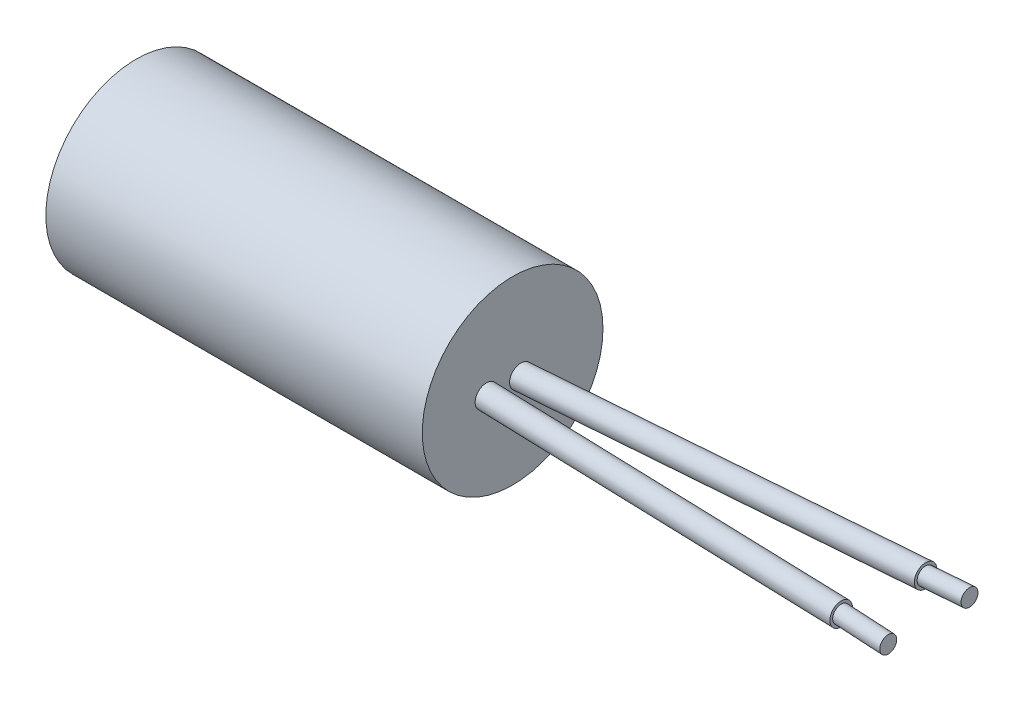
ISO-10303-21;
HEADER;
FILE_DESCRIPTION(('STEP AP214'),'2;1');
FILE_NAME('part.step','',(''),(''),'','','');
FILE_SCHEMA(('AUTOMOTIVE_DESIGN { 1 0 10303 214 1 1 1 1 }'));
ENDSEC;
DATA;
#1=APPLICATION_CONTEXT('core data for automotive mechanical design processes');
#2=APPLICATION_PROTOCOL_DEFINITION('international standard','automotive_design',2000,#1);
#3=PRODUCT_CONTEXT('',#1,'mechanical');
#4=PRODUCT('Part','Part','',(#3));
#5=PRODUCT_RELATED_PRODUCT_CATEGORY('part','',(#4));
#6=PRODUCT_DEFINITION_FORMATION('','',#4);
#7=PRODUCT_DEFINITION_CONTEXT('part definition',#1,'design');
#8=PRODUCT_DEFINITION('design','',#6,#7);
#9=PRODUCT_DEFINITION_SHAPE('','',#8);
#10=(LENGTH_UNIT() NAMED_UNIT(*) SI_UNIT(.MILLI.,.METRE.));
#11=(NAMED_UNIT(*) PLANE_ANGLE_UNIT() SI_UNIT($,.RADIAN.));
#12=(NAMED_UNIT(*) SI_UNIT($,.STERADIAN.) SOLID_ANGLE_UNIT());
#13=UNCERTAINTY_MEASURE_WITH_UNIT(LENGTH_MEASURE(1.E-05),#10,'distance_accuracy_value','');
#14=(GEOMETRIC_REPRESENTATION_CONTEXT(3) GLOBAL_UNCERTAINTY_ASSIGNED_CONTEXT((#13)) GLOBAL_UNIT_ASSIGNED_CONTEXT((#10,
#11,#12)) REPRESENTATION_CONTEXT('',''));
#15=CARTESIAN_POINT('',(0.,0.,0.));
#16=DIRECTION('',(0.,0.,1.));
#17=DIRECTION('',(1.,0.,0.));
#18=AXIS2_PLACEMENT_3D('',#15,#16,#17);
#19=CARTESIAN_POINT('',(20.,0.,0.));
#20=DIRECTION('',(-1.,0.,0.));
#21=DIRECTION('',(0.,0.,1.));
#22=AXIS2_PLACEMENT_3D('',#19,#20,#21);
#23=CYLINDRICAL_SURFACE('',#22,4.8);
#24=CARTESIAN_POINT('',(20.,0.,0.));
#25=DIRECTION('',(1.,0.,0.));
#26=DIRECTION('',(0.,0.,-1.));
#27=AXIS2_PLACEMENT_3D('',#24,#25,#26);
#28=CIRCLE('',#27,4.8);
#29=CARTESIAN_POINT('',(20.,0.,-4.8));
#30=VERTEX_POINT('',#29);
#31=EDGE_CURVE('E66',#30,#30,#28,.T.);
#32=ORIENTED_EDGE('',*,*,#31,.F.);
#33=EDGE_LOOP('',(#32));
#34=FACE_BOUND('',#33,.T.);
#35=CARTESIAN_POINT('',(0.,0.,0.));
#36=DIRECTION('',(1.,0.,0.));
#37=DIRECTION('',(0.,0.,-1.));
#38=AXIS2_PLACEMENT_3D('',#35,#36,#37);
#39=CIRCLE('',#38,4.8);
#40=CARTESIAN_POINT('',(0.,0.,-4.8));
#41=VERTEX_POINT('',#40);
#42=EDGE_CURVE('E60',#41,#41,#39,.T.);
#43=ORIENTED_EDGE('',*,*,#42,.T.);
#44=EDGE_LOOP('',(#43));
#45=FACE_BOUND('',#44,.T.);
#46=ADVANCED_FACE('F33',(#34,#45),#23,.T.);
#47=CARTESIAN_POINT('',(20.,0.,0.));
#48=DIRECTION('',(1.,0.,0.));
#49=DIRECTION('',(0.,0.,-1.));
#50=AXIS2_PLACEMENT_3D('',#47,#48,#49);
#51=PLANE('',#50);
#52=CARTESIAN_POINT('',(20.,0.,1.39254345856469));
#53=DIRECTION('',(1.,0.,0.));
#54=DIRECTION('',(0.,0.,-1.));
#55=AXIS2_PLACEMENT_3D('',#52,#53,#54);
#56=CIRCLE('',#55,0.6);
#57=CARTESIAN_POINT('',(20.,0.,0.792543458564689));
#58=VERTEX_POINT('',#57);
#59=EDGE_CURVE('E73',#58,#58,#56,.T.);
#60=ORIENTED_EDGE('',*,*,#59,.F.);
#61=EDGE_LOOP('',(#60));
#62=FACE_BOUND('',#61,.T.);
#63=CARTESIAN_POINT('',(20.,0.,-0.437533255997647));
#64=DIRECTION('',(1.,0.,0.));
#65=DIRECTION('',(0.,0.,-1.));
#66=AXIS2_PLACEMENT_3D('',#63,#64,#65);
#67=CIRCLE('',#66,0.6);
#68=CARTESIAN_POINT('',(20.,0.,-1.03753325599765));
#69=VERTEX_POINT('',#68);
#70=EDGE_CURVE('E69',#69,#69,#67,.T.);
#71=ORIENTED_EDGE('',*,*,#70,.F.);
#72=EDGE_LOOP('',(#71));
#73=FACE_BOUND('',#72,.T.);
#74=ORIENTED_EDGE('',*,*,#31,.T.);
#75=EDGE_LOOP('',(#74));
#76=FACE_BOUND('',#75,.T.);
#77=ADVANCED_FACE('F94',(#62,#73,#76),#51,.T.);
#78=CARTESIAN_POINT('',(0.,0.,0.));
#79=DIRECTION('',(1.,0.,0.));
#80=DIRECTION('',(0.,0.,-1.));
#81=AXIS2_PLACEMENT_3D('',#78,#79,#80);
#82=PLANE('',#81);
#83=ORIENTED_EDGE('',*,*,#42,.F.);
#84=EDGE_LOOP('',(#83));
#85=FACE_BOUND('',#84,.T.);
#86=ADVANCED_FACE('F85',(#85),#82,.F.);
#87=CARTESIAN_POINT('',(39.9388740322488,0.,-2.00000000000003));
#88=DIRECTION('',(1.,0.,0.));
#89=DIRECTION('',(0.,0.,-1.));
#90=AXIS2_PLACEMENT_3D('',#87,#88,#89);
#91=PLANE('',#90);
#92=CARTESIAN_POINT('',(39.9388740322488,0.,-2.00000000000003));
#93=DIRECTION('',(1.,0.,0.));
#94=DIRECTION('',(0.,0.,-1.));
#95=AXIS2_PLACEMENT_3D('',#92,#93,#94);
#96=CIRCLE('',#95,0.45);
#97=CARTESIAN_POINT('',(39.9388740322488,0.,-2.45000000000003));
#98=VERTEX_POINT('',#97);
#99=EDGE_CURVE('E45',#98,#98,#96,.T.);
#100=ORIENTED_EDGE('',*,*,#99,.F.);
#101=EDGE_LOOP('',(#100));
#102=FACE_BOUND('',#101,.T.);
#103=CARTESIAN_POINT('',(39.9388740322488,0.,-2.00000000000003));
#104=DIRECTION('',(1.,0.,0.));
#105=DIRECTION('',(0.,0.,-1.));
#106=AXIS2_PLACEMENT_3D('',#103,#104,#105);
#107=CIRCLE('',#106,0.6);
#108=CARTESIAN_POINT('',(39.9388740322488,0.,-2.60000000000003));
#109=VERTEX_POINT('',#108);
#110=EDGE_CURVE('E51',#109,#109,#107,.T.);
#111=ORIENTED_EDGE('',*,*,#110,.T.);
#112=EDGE_LOOP('',(#111));
#113=FACE_BOUND('',#112,.T.);
#114=ADVANCED_FACE('F82',(#102,#113),#91,.T.);
#115=CARTESIAN_POINT('',(20.,0.,-1.03753325599765));
#116=CARTESIAN_POINT('',(39.9388740322488,0.,-2.60000000000003));
#117=CARTESIAN_POINT('',(20.,1.2,-1.03753325599765));
#118=CARTESIAN_POINT('',(39.9388740322488,1.2,-2.60000000000003));
#119=CARTESIAN_POINT('',(20.,1.2,0.162466744002353));
#120=CARTESIAN_POINT('',(39.9388740322488,1.2,-1.40000000000003));
#121=CARTESIAN_POINT('',(20.,0.,0.162466744002353));
#122=CARTESIAN_POINT('',(39.9388740322488,0.,-1.40000000000003));
#123=CARTESIAN_POINT('',(20.,-1.2,0.162466744002353));
#124=CARTESIAN_POINT('',(39.9388740322488,-1.2,-1.40000000000003));
#125=CARTESIAN_POINT('',(20.,-1.2,-1.03753325599765));
#126=CARTESIAN_POINT('',(39.9388740322488,-1.2,-2.60000000000003));
#127=CARTESIAN_POINT('',(20.,0.,-1.03753325599765));
#128=CARTESIAN_POINT('',(39.9388740322488,0.,-2.60000000000003));
#129=(BOUNDED_SURFACE() B_SPLINE_SURFACE(3,1,((#115,#116),(#117,#118),(#119,#120),(#121,#122),
(#123,#124),(#125,#126),(#127,#128)),.UNSPECIFIED.,.T.,.F.,.F.) B_SPLINE_SURFACE_WITH_KNOTS((4,
3,4),(2,2),(0.,0.5,1.),(0.,1.),
.UNSPECIFIED.) GEOMETRIC_REPRESENTATION_ITEM() RATIONAL_B_SPLINE_SURFACE(((1.,1.),
(0.333333333333333,0.333333333333333),(0.333333333333333,0.333333333333333),(1.,1.),
(0.333333333333333,0.333333333333333),(0.333333333333333,0.333333333333333),(1.,1.))) REPRESENTATION_ITEM('') SURFACE());
#130=ORIENTED_EDGE('',*,*,#110,.F.);
#131=EDGE_LOOP('',(#130));
#132=FACE_BOUND('',#131,.T.);
#133=ORIENTED_EDGE('',*,*,#70,.T.);
#134=EDGE_LOOP('',(#133));
#135=FACE_BOUND('',#134,.T.);
#136=ADVANCED_FACE('F84',(#132,#135),#129,.T.);
#137=CARTESIAN_POINT('',(39.4528498119146,0.,2.));
#138=DIRECTION('',(1.,0.,0.));
#139=DIRECTION('',(0.,0.,-1.));
#140=AXIS2_PLACEMENT_3D('',#137,#138,#139);
#141=PLANE('',#140);
#142=CARTESIAN_POINT('',(39.4528498119146,0.,2.));
#143=DIRECTION('',(1.,0.,0.));
#144=DIRECTION('',(0.,0.,-1.));
#145=AXIS2_PLACEMENT_3D('',#142,#143,#144);
#146=CIRCLE('',#145,0.45);
#147=CARTESIAN_POINT('',(39.4528498119146,0.,1.55));
#148=VERTEX_POINT('',#147);
#149=EDGE_CURVE('E11',#148,#148,#146,.T.);
#150=ORIENTED_EDGE('',*,*,#149,.F.);
#151=EDGE_LOOP('',(#150));
#152=FACE_BOUND('',#151,.T.);
#153=CARTESIAN_POINT('',(39.4528498119146,0.,2.));
#154=DIRECTION('',(1.,0.,0.));
#155=DIRECTION('',(0.,0.,-1.));
#156=AXIS2_PLACEMENT_3D('',#153,#154,#155);
#157=CIRCLE('',#156,0.6);
#158=CARTESIAN_POINT('',(39.4528498119146,0.,1.4));
#159=VERTEX_POINT('',#158);
#160=EDGE_CURVE('E55',#159,#159,#157,.T.);
#161=ORIENTED_EDGE('',*,*,#160,.T.);
#162=EDGE_LOOP('',(#161));
#163=FACE_BOUND('',#162,.T.);
#164=ADVANCED_FACE('F56',(#152,#163),#141,.T.);
#165=CARTESIAN_POINT('',(20.,0.,0.792543458564689));
#166=CARTESIAN_POINT('',(39.4528498119146,0.,1.4));
#167=CARTESIAN_POINT('',(20.,1.2,0.792543458564689));
#168=CARTESIAN_POINT('',(39.4528498119146,1.2,1.4));
#169=CARTESIAN_POINT('',(20.,1.2,1.99254345856469));
#170=CARTESIAN_POINT('',(39.4528498119146,1.2,2.6));
#171=CARTESIAN_POINT('',(20.,0.,1.99254345856469));
#172=CARTESIAN_POINT('',(39.4528498119146,0.,2.6));
#173=CARTESIAN_POINT('',(20.,-1.2,1.99254345856469));
#174=CARTESIAN_POINT('',(39.4528498119146,-1.2,2.6));
#175=CARTESIAN_POINT('',(20.,-1.2,0.792543458564689));
#176=CARTESIAN_POINT('',(39.4528498119146,-1.2,1.4));
#177=CARTESIAN_POINT('',(20.,0.,0.792543458564689));
#178=CARTESIAN_POINT('',(39.4528498119146,0.,1.4));
#179=(BOUNDED_SURFACE() B_SPLINE_SURFACE(3,1,((#165,#166),(#167,#168),(#169,#170),(#171,#172),
(#173,#174),(#175,#176),(#177,#178)),.UNSPECIFIED.,.T.,.F.,.F.) B_SPLINE_SURFACE_WITH_KNOTS((4,
3,4),(2,2),(0.,0.5,1.),(0.,1.),
.UNSPECIFIED.) GEOMETRIC_REPRESENTATION_ITEM() RATIONAL_B_SPLINE_SURFACE(((1.,1.),
(0.333333333333333,0.333333333333333),(0.333333333333333,0.333333333333333),(1.,1.),
(0.333333333333333,0.333333333333333),(0.333333333333333,0.333333333333333),(1.,1.))) REPRESENTATION_ITEM('') SURFACE());
#180=ORIENTED_EDGE('',*,*,#160,.F.);
#181=EDGE_LOOP('',(#180));
#182=FACE_BOUND('',#181,.T.);
#183=ORIENTED_EDGE('',*,*,#59,.T.);
#184=EDGE_LOOP('',(#183));
#185=FACE_BOUND('',#184,.T.);
#186=ADVANCED_FACE('F87',(#182,#185),#179,.T.);
#187=CARTESIAN_POINT('',(39.9388740322488,0.,-2.45000000000003));
#188=CARTESIAN_POINT('',(52.6031303910479,0.,-3.44885690181726));
#189=CARTESIAN_POINT('',(39.9388740322488,0.899999999999999,-2.45000000000003));
#190=CARTESIAN_POINT('',(52.6031303910479,0.899999999999999,-3.44885690181726));
#191=CARTESIAN_POINT('',(39.9388740322488,0.9,-1.55000000000003));
#192=CARTESIAN_POINT('',(52.6031303910479,0.9,-2.54885690181726));
#193=CARTESIAN_POINT('',(39.9388740322488,0.,-1.55000000000003));
#194=CARTESIAN_POINT('',(52.6031303910479,0.,-2.54885690181726));
#195=CARTESIAN_POINT('',(39.9388740322488,-0.899999999999999,-1.55000000000003));
#196=CARTESIAN_POINT('',(52.6031303910479,-0.899999999999999,-2.54885690181726));
#197=CARTESIAN_POINT('',(39.9388740322488,-0.899999999999999,-2.45000000000003));
#198=CARTESIAN_POINT('',(52.6031303910479,-0.899999999999999,-3.44885690181726));
#199=CARTESIAN_POINT('',(39.9388740322488,0.,-2.45000000000003));
#200=CARTESIAN_POINT('',(52.6031303910479,0.,-3.44885690181726));
#201=(BOUNDED_SURFACE() B_SPLINE_SURFACE(3,1,((#187,#188),(#189,#190),(#191,#192),(#193,#194),
(#195,#196),(#197,#198),(#199,#200)),.UNSPECIFIED.,.T.,.F.,.F.) B_SPLINE_SURFACE_WITH_KNOTS((4,
3,4),(2,2),(0.,0.5,1.),(0.,1.),
.UNSPECIFIED.) GEOMETRIC_REPRESENTATION_ITEM() RATIONAL_B_SPLINE_SURFACE(((1.,1.),
(0.333333333333333,0.333333333333333),(0.333333333333333,0.333333333333333),(1.,1.),
(0.333333333333333,0.333333333333333),(0.333333333333333,0.333333333333333),(1.,1.))) REPRESENTATION_ITEM('') SURFACE());
#202=CARTESIAN_POINT('',(42.1027106585511,0.,-2.62066640846113));
#203=CARTESIAN_POINT('',(42.1027106585511,0.0249169708233576,-2.62066468284198));
#204=CARTESIAN_POINT('',(42.1027106585511,0.0498735638924442,-2.61858791322274));
#205=CARTESIAN_POINT('',(42.1027106585511,0.0994201301037329,-2.61027605702568));
#206=CARTESIAN_POINT('',(42.1027106585511,0.124000219793935,-2.60398370433206));
#207=CARTESIAN_POINT('',(42.1027106585511,0.171791638147212,-2.58735333393948));
#208=CARTESIAN_POINT('',(42.1027106585511,0.195001218587728,-2.57701027218953));
#209=CARTESIAN_POINT('',(42.1027106585511,0.239322182250796,-2.55258847955456));
#210=CARTESIAN_POINT('',(42.1027106585511,0.260436288226527,-2.53851468590238));
#211=CARTESIAN_POINT('',(42.1027106585511,0.300032074374395,-2.5070022088804));
#212=CARTESIAN_POINT('',(42.1027106585511,0.318510060414362,-2.48955888259262));
#213=CARTESIAN_POINT('',(42.1027106585511,0.352249191138487,-2.45184228675642));
#214=CARTESIAN_POINT('',(42.1027106585511,0.367514773498238,-2.43157298632042));
#215=CARTESIAN_POINT('',(42.1027106585511,0.39444792500363,-2.38873044271663));
#216=CARTESIAN_POINT('',(42.1027106585511,0.406110437057161,-2.36615401995835));
#217=CARTESIAN_POINT('',(42.1027106585511,0.425463238105003,-2.31939562393228));
#218=CARTESIAN_POINT('',(42.1027106585511,0.433159047641659,-2.29521593518316));
#219=CARTESIAN_POINT('',(42.1027106585511,0.444392839476786,-2.24587345011621));
#220=CARTESIAN_POINT('',(42.1027106585511,0.44792499547885,-2.22070932697466));
#221=CARTESIAN_POINT('',(42.1027106585511,0.450709561812633,-2.17018086717254));
#222=CARTESIAN_POINT('',(42.1027106585511,0.449967938357008,-2.14481685895979));
#223=CARTESIAN_POINT('',(42.1027106585511,0.444235829939363,-2.09453742119792));
#224=CARTESIAN_POINT('',(42.1027106585511,0.439239408370549,-2.06962266810674));
#225=CARTESIAN_POINT('',(42.1027106585511,0.425141800091125,-2.02102084379071));
#226=CARTESIAN_POINT('',(42.1027106585511,0.416046350234093,-1.99733210815797));
#227=CARTESIAN_POINT('',(42.1027106585511,0.393994589805185,-1.9517843441705));
#228=CARTESIAN_POINT('',(42.1027106585511,0.381032904079508,-1.92992791779314));
#229=CARTESIAN_POINT('',(42.1027106585511,0.351642568180791,-1.88873229266478));
#230=CARTESIAN_POINT('',(42.1027106585511,0.335218789415721,-1.86938961806514));
#231=CARTESIAN_POINT('',(42.1027106585511,0.299333566240612,-1.83370867367305));
#232=CARTESIAN_POINT('',(42.1027106585511,0.279867893291832,-1.81737465613546));
#233=CARTESIAN_POINT('',(42.1027106585511,0.238501030378269,-1.78823154007281));
#234=CARTESIAN_POINT('',(42.1027106585511,0.216603620810612,-1.77541707483586));
#235=CARTESIAN_POINT('',(42.1027106585511,0.170931229519899,-1.75362469725253));
#236=CARTESIAN_POINT('',(42.1027106585511,0.147153175751548,-1.74465322246248));
#237=CARTESIAN_POINT('',(42.1027106585511,0.0984276882864975,-1.73083316510967));
#238=CARTESIAN_POINT('',(42.1027106585511,0.0734802545897989,-1.72598458254691));
#239=CARTESIAN_POINT('',(42.1027106585511,0.0231675449583439,-1.72055261269379));
#240=CARTESIAN_POINT('',(42.1027106585511,-0.00219696567172409,-1.71996213358403));
#241=CARTESIAN_POINT('',(42.1027106585511,-0.0527046230593558,-1.72304679018559));
#242=CARTESIAN_POINT('',(42.1027106585511,-0.0778473700323223,-1.72672847823777));
#243=CARTESIAN_POINT('',(42.1027106585511,-0.127122204123095,-1.7382553928436));
#244=CARTESIAN_POINT('',(42.1027106585511,-0.151255657551087,-1.74609478027002));
#245=CARTESIAN_POINT('',(42.1027106585511,-0.197898128484458,-1.76572514651904));
#246=CARTESIAN_POINT('',(42.1027106585511,-0.220404824909433,-1.77752164120236));
#247=CARTESIAN_POINT('',(42.1027106585511,-0.263086516942704,-1.80470899317205));
#248=CARTESIAN_POINT('',(42.1027106585511,-0.283264721167097,-1.82009481385864));
#249=CARTESIAN_POINT('',(42.1027106585511,-0.320780201026219,-1.85405756782291));
#250=CARTESIAN_POINT('',(42.1027106585511,-0.338113467960474,-1.87263892964806));
#251=CARTESIAN_POINT('',(42.1027106585511,-0.369389973372898,-1.91242157833041));
#252=CARTESIAN_POINT('',(42.1027106585511,-0.383337909256394,-1.93361917259606));
#253=CARTESIAN_POINT('',(42.1027106585511,-0.407496731005957,-1.97808523167471));
#254=CARTESIAN_POINT('',(42.1027106585511,-0.417702366642248,-2.00135654937639));
#255=CARTESIAN_POINT('',(42.1027106585511,-0.434047497968231,-2.04924930056035));
#256=CARTESIAN_POINT('',(42.1027106585511,-0.440192649014585,-2.07386880431004));
#257=CARTESIAN_POINT('',(42.1027106585511,-0.448271095054409,-2.12382496265711));
#258=CARTESIAN_POINT('',(42.1027106585511,-0.450198490949805,-2.14916257154831));
#259=CARTESIAN_POINT('',(42.1027106585511,-0.449769457092566,-2.19976588195062));
#260=CARTESIAN_POINT('',(42.1027106585511,-0.447419003176065,-2.22503163446592));
#261=CARTESIAN_POINT('',(42.1027106585511,-0.438506438384694,-2.27484490873543));
#262=CARTESIAN_POINT('',(42.1027106585511,-0.431938579950315,-2.29939140246218));
#263=CARTESIAN_POINT('',(42.1027106585511,-0.414783994121576,-2.34700023446078));
#264=CARTESIAN_POINT('',(42.1027106585511,-0.404202630771566,-2.37006450581592));
#265=CARTESIAN_POINT('',(42.1027106585511,-0.379311243094743,-2.4141068931995));
#266=CARTESIAN_POINT('',(42.1027106585511,-0.364998523398975,-2.43508348598267));
#267=CARTESIAN_POINT('',(42.1027106585511,-0.333056136365596,-2.47433356060421));
#268=CARTESIAN_POINT('',(42.1027106585511,-0.315426850853508,-2.4926073531751));
#269=CARTESIAN_POINT('',(42.1027106585511,-0.277349169256508,-2.5259378307371));
#270=CARTESIAN_POINT('',(42.1027106585511,-0.256900482176155,-2.54099418324095));
#271=CARTESIAN_POINT('',(42.1027106585511,-0.213765957504363,-2.56745863902884));
#272=CARTESIAN_POINT('',(42.1027106585511,-0.191080324781593,-2.57886707599868));
#273=CARTESIAN_POINT('',(42.1027106585511,-0.144091064210825,-2.59772626474744));
#274=CARTESIAN_POINT('',(42.1027106585511,-0.119785374384991,-2.60517186012512));
#275=CARTESIAN_POINT('',(42.1027106585511,-0.0703082587893463,-2.61585659822849));
#276=CARTESIAN_POINT('',(42.1027106585511,-0.0451391505627894,-2.6191062160103));
#277=CARTESIAN_POINT('',(42.1027106585511,-0.0132814722503355,-2.62051987553916));
#278=CARTESIAN_POINT('',(42.1027106585511,-0.00664214390638122,-2.6206668684613));
#279=CARTESIAN_POINT('',(42.1027106585511,0.,-2.62066640846113));
#280=B_SPLINE_CURVE_WITH_KNOTS('',3,(#202,#203,#204,#205,#206,#207,#208,#209,#210,#211,#212,
#213,#214,#215,#216,#217,#218,#219,#220,#221,#222,#223,#224,#225,#226,#227,#228,#229,#230,#231,
#232,#233,#234,#235,#236,#237,#238,#239,#240,#241,#242,#243,#244,#245,#246,#247,#248,#249,#250,
#251,#252,#253,#254,#255,#256,#257,#258,#259,#260,#261,#262,#263,#264,#265,#266,#267,#268,#269,
#270,#271,#272,#273,#274,#275,#276,#277,#278,#279),.UNSPECIFIED.,.T.,.F.,(4,2,2,2,2,2,2,2,2,2,2,
2,2,2,2,2,2,2,2,2,2,2,2,2,2,2,2,2,2,2,2,2,2,2,2,2,2,2,4),(0.,0.0747343630709115,
0.150505105538542,0.22637050129657,0.302135994089333,0.37800663947281,0.453771777503437,
0.529642777645514,0.605407899481833,0.681278915818047,0.75704404160321,0.832915053990644,
0.908680208207083,0.984551192163512,1.06031612452615,1.13618733033416,1.21194219507117,
1.28782346839438,1.36370474171755,1.43945960645463,1.51533081226183,1.59109574462528,
1.66696672857419,1.74273188279815,1.81860289514919,1.89436802097073,1.97023903782492,
2.04600415914267,2.12187518062958,2.19764029731288,2.27350888792075,2.34927643551197,
2.42509886665742,2.50091257394701,2.57673411196968,2.6525487123827,2.72846172214119,
2.80418484996963,2.82410687009751),.UNSPECIFIED.);
#281=CARTESIAN_POINT('',(42.1027106585511,0.,-2.62066640846113));
#282=VERTEX_POINT('',#281);
#283=EDGE_CURVE('E58',#282,#282,#280,.T.);
#284=CARTESIAN_POINT('',(42.1027106585511,0.,-2.62066640846113));
#285=CARTESIAN_POINT('',(42.0801706936938,0.,-2.618888633373));
#286=CARTESIAN_POINT('',(42.0576307288365,0.,-2.61711085828486));
#287=CARTESIAN_POINT('',(42.0125507991218,0.,-2.61355530810859));
#288=CARTESIAN_POINT('',(41.9900108342645,0.,-2.61177753302045));
#289=CARTESIAN_POINT('',(41.9449309045499,0.,-2.60822198284418));
#290=CARTESIAN_POINT('',(41.9223909396926,0.,-2.60644420775604));
#291=CARTESIAN_POINT('',(41.8773110099779,0.,-2.60288865757977));
#292=CARTESIAN_POINT('',(41.8547710451206,0.,-2.60111088249163));
#293=CARTESIAN_POINT('',(41.809691115406,0.,-2.59755533231536));
#294=CARTESIAN_POINT('',(41.7871511505487,0.,-2.59577755722722));
#295=CARTESIAN_POINT('',(41.742071220834,0.,-2.59222200705095));
#296=CARTESIAN_POINT('',(41.7195312559767,0.,-2.59044423196281));
#297=CARTESIAN_POINT('',(41.6744513262621,0.,-2.58688868178654));
#298=CARTESIAN_POINT('',(41.6519113614048,0.,-2.5851109066984));
#299=CARTESIAN_POINT('',(41.6068314316901,0.,-2.58155535652213));
#300=CARTESIAN_POINT('',(41.5842914668328,0.,-2.57977758143399));
#301=CARTESIAN_POINT('',(41.5392115371182,0.,-2.57622203125772));
#302=CARTESIAN_POINT('',(41.5166715722609,0.,-2.57444425616958));
#303=CARTESIAN_POINT('',(41.4715916425463,0.,-2.57088870599331));
#304=CARTESIAN_POINT('',(41.4490516776889,0.,-2.56911093090517));
#305=CARTESIAN_POINT('',(41.4039717479743,0.,-2.5655553807289));
#306=CARTESIAN_POINT('',(41.381431783117,0.,-2.56377760564076));
#307=CARTESIAN_POINT('',(41.3363518534024,0.,-2.56022205546449));
#308=CARTESIAN_POINT('',(41.3138118885451,0.,-2.55844428037635));
#309=CARTESIAN_POINT('',(41.2687319588304,0.,-2.55488873020008));
#310=CARTESIAN_POINT('',(41.2461919939731,0.,-2.55311095511195));
#311=CARTESIAN_POINT('',(41.2011120642585,0.,-2.54955540493567));
#312=CARTESIAN_POINT('',(41.1785720994012,0.,-2.54777762984754));
#313=CARTESIAN_POINT('',(41.1334921696865,0.,-2.54422207967126));
#314=CARTESIAN_POINT('',(41.1109522048292,0.,-2.54244430458313));
#315=CARTESIAN_POINT('',(41.0658722751146,0.,-2.53888875440685));
#316=CARTESIAN_POINT('',(41.0433323102573,0.,-2.53711097931872));
#317=CARTESIAN_POINT('',(40.9982523805426,0.,-2.53355542914244));
#318=CARTESIAN_POINT('',(40.9757124156853,0.,-2.53177765405431));
#319=CARTESIAN_POINT('',(40.9306324859707,0.,-2.52822210387803));
#320=CARTESIAN_POINT('',(40.9080925211134,0.,-2.5264443287899));
#321=CARTESIAN_POINT('',(40.8630125913988,0.,-2.52288877861362));
#322=CARTESIAN_POINT('',(40.8404726265414,0.,-2.52111100352549));
#323=CARTESIAN_POINT('',(40.7953926968268,0.,-2.51755545334921));
#324=CARTESIAN_POINT('',(40.7728527319695,0.,-2.51577767826108));
#325=CARTESIAN_POINT('',(40.7277728022549,0.,-2.51222212808481));
#326=CARTESIAN_POINT('',(40.7052328373975,0.,-2.51044435299667));
#327=CARTESIAN_POINT('',(40.6601529076829,0.,-2.5068888028204));
#328=CARTESIAN_POINT('',(40.6376129428256,0.,-2.50511102773226));
#329=CARTESIAN_POINT('',(40.592533013111,0.,-2.50155547755599));
#330=CARTESIAN_POINT('',(40.5699930482537,0.,-2.49977770246785));
#331=CARTESIAN_POINT('',(40.524913118539,0.,-2.49622215229158));
#332=CARTESIAN_POINT('',(40.5023731536817,0.,-2.49444437720344));
#333=CARTESIAN_POINT('',(40.4572932239671,0.,-2.49088882702717));
#334=CARTESIAN_POINT('',(40.4347532591098,0.,-2.48911105193903));
#335=CARTESIAN_POINT('',(40.3896733293951,0.,-2.48555550176276));
#336=CARTESIAN_POINT('',(40.3671333645378,0.,-2.48377772667462));
#337=CARTESIAN_POINT('',(40.3220534348232,0.,-2.48022217649835));
#338=CARTESIAN_POINT('',(40.2995134699659,0.,-2.47844440141021));
#339=CARTESIAN_POINT('',(40.2544335402512,0.,-2.47488885123394));
#340=CARTESIAN_POINT('',(40.2318935753939,0.,-2.4731110761458));
#341=CARTESIAN_POINT('',(40.1868136456793,0.,-2.46955552596953));
#342=CARTESIAN_POINT('',(40.164273680822,0.,-2.46777775088139));
#343=CARTESIAN_POINT('',(40.1191937511074,0.,-2.46422220070512));
#344=CARTESIAN_POINT('',(40.09665378625,0.,-2.46244442561698));
#345=CARTESIAN_POINT('',(40.0515738565354,0.,-2.45888887544071));
#346=CARTESIAN_POINT('',(40.0290338916781,0.,-2.45711110035257));
#347=CARTESIAN_POINT('',(39.9839539619635,0.,-2.4535555501763));
#348=CARTESIAN_POINT('',(39.9614139971061,0.,-2.45177777508817));
#349=CARTESIAN_POINT('',(39.9388740322488,0.,-2.45000000000003));
#350=B_SPLINE_CURVE_WITH_KNOTS('',3,(#284,#285,#286,#287,#288,#289,#290,#291,#292,#293,#294,
#295,#296,#297,#298,#299,#300,#301,#302,#303,#304,#305,#306,#307,#308,#309,#310,#311,#312,#313,
#314,#315,#316,#317,#318,#319,#320,#321,#322,#323,#324,#325,#326,#327,#328,#329,#330,#331,#332,
#333,#334,#335,#336,#337,#338,#339,#340,#341,#342,#343,#344,#345,#346,#347,#348,#349),
.UNSPECIFIED.,.F.,.F.,(4,2,2,2,2,2,2,2,2,2,2,2,2,2,2,2,2,2,2,2,2,2,2,2,2,2,2,2,2,2,2,2,4),(0.,
0.0678298938543808,0.135659787708755,0.203489681563149,0.27131957541753,0.339149469271918,
0.406979363126299,0.474809256980687,0.542639150835067,0.610469044689448,0.678298938543829,
0.746128832398217,0.813958726252598,0.881788620106985,0.949618513961366,1.01744840781575,
1.08527830167013,1.15310819552452,1.2209380893789,1.28876798323328,1.35659787708767,
1.42442777094205,1.49225766479644,1.56008755865082,1.62791745250521,1.69574734635959,
1.76357724021397,1.83140713406836,1.89923702792274,1.96706692177713,2.03489681563151,
2.1027267094859,2.17055660334028),.UNSPECIFIED.);
#351=EDGE_CURVE('BSEAM80',#282,#98,#350,.T.);
#352=ORIENTED_EDGE('',*,*,#283,.F.);
#353=ORIENTED_EDGE('',*,*,#99,.T.);
#354=ORIENTED_EDGE('',*,*,#351,.T.);
#355=ORIENTED_EDGE('',*,*,#351,.F.);
#356=EDGE_LOOP('',(#352,#354,#353,#355));
#357=FACE_BOUND('',#356,.T.);
#358=ADVANCED_FACE('F80',(#357),#201,.T.);
#359=CARTESIAN_POINT('',(39.4528498119146,0.,1.55));
#360=CARTESIAN_POINT('',(53.10229782397,0.,2.31425800555525));
#361=CARTESIAN_POINT('',(39.4528498119146,0.899999999999999,1.55));
#362=CARTESIAN_POINT('',(53.10229782397,0.899999999999999,2.31425800555525));
#363=CARTESIAN_POINT('',(39.4528498119146,0.9,2.45));
#364=CARTESIAN_POINT('',(53.10229782397,0.9,3.21425800555525));
#365=CARTESIAN_POINT('',(39.4528498119146,0.,2.45));
#366=CARTESIAN_POINT('',(53.10229782397,0.,3.21425800555525));
#367=CARTESIAN_POINT('',(39.4528498119146,-0.899999999999999,2.45));
#368=CARTESIAN_POINT('',(53.10229782397,-0.899999999999999,3.21425800555525));
#369=CARTESIAN_POINT('',(39.4528498119146,-0.899999999999999,1.55));
#370=CARTESIAN_POINT('',(53.10229782397,-0.899999999999999,2.31425800555525));
#371=CARTESIAN_POINT('',(39.4528498119146,0.,1.55));
#372=CARTESIAN_POINT('',(53.10229782397,0.,2.31425800555525));
#373=(BOUNDED_SURFACE() B_SPLINE_SURFACE(3,1,((#359,#360),(#361,#362),(#363,#364),(#365,#366),
(#367,#368),(#369,#370),(#371,#372)),.UNSPECIFIED.,.T.,.F.,.F.) B_SPLINE_SURFACE_WITH_KNOTS((4,
3,4),(2,2),(0.,0.5,1.),(0.,1.),
.UNSPECIFIED.) GEOMETRIC_REPRESENTATION_ITEM() RATIONAL_B_SPLINE_SURFACE(((1.,1.),
(0.333333333333333,0.333333333333333),(0.333333333333333,0.333333333333333),(1.,1.),
(0.333333333333333,0.333333333333333),(0.333333333333333,0.333333333333333),(1.,1.))) REPRESENTATION_ITEM('') SURFACE());
#374=CARTESIAN_POINT('',(42.1027106585511,0.,1.69837064208462));
#375=CARTESIAN_POINT('',(42.1027106585511,0.0249169708233586,1.69837236770378));
#376=CARTESIAN_POINT('',(42.1027106585511,0.0498735638924465,1.70044913732301));
#377=CARTESIAN_POINT('',(42.1027106585511,0.0994201301037363,1.70876099352008));
#378=CARTESIAN_POINT('',(42.1027106585511,0.124000219793938,1.7150533462137));
#379=CARTESIAN_POINT('',(42.1027106585511,0.171791638147218,1.73168371660628));
#380=CARTESIAN_POINT('',(42.1027106585511,0.195001218587737,1.74202677835623));
#381=CARTESIAN_POINT('',(42.1027106585511,0.239322182250802,1.7664485709912));
#382=CARTESIAN_POINT('',(42.1027106585511,0.260436288226528,1.78052236464339));
#383=CARTESIAN_POINT('',(42.1027106585511,0.300032074374397,1.81203484166537));
#384=CARTESIAN_POINT('',(42.1027106585511,0.31851006041437,1.82947816795314));
#385=CARTESIAN_POINT('',(42.1027106585511,0.352249191138493,1.86719476378934));
#386=CARTESIAN_POINT('',(42.1027106585511,0.367514773498236,1.88746406422535));
#387=CARTESIAN_POINT('',(42.1027106585511,0.394447925003626,1.93030660782914));
#388=CARTESIAN_POINT('',(42.1027106585511,0.406110437057163,1.95288303058742));
#389=CARTESIAN_POINT('',(42.1027106585511,0.425463238105007,1.99964142661349));
#390=CARTESIAN_POINT('',(42.1027106585511,0.43315904764166,2.02382111536261));
#391=CARTESIAN_POINT('',(42.1027106585511,0.444392839476785,2.07316360042956));
#392=CARTESIAN_POINT('',(42.1027106585511,0.447924995478851,2.0983277235711));
#393=CARTESIAN_POINT('',(42.1027106585511,0.450709561812633,2.14885618337322));
#394=CARTESIAN_POINT('',(42.1027106585511,0.449967938357007,2.17422019158598));
#395=CARTESIAN_POINT('',(42.1027106585511,0.444235829939361,2.22449962934784));
#396=CARTESIAN_POINT('',(42.1027106585511,0.439239408370548,2.24941438243903));
#397=CARTESIAN_POINT('',(42.1027106585511,0.42514180009112,2.29801620675505));
#398=CARTESIAN_POINT('',(42.1027106585511,0.416046350234083,2.32170494238779));
#399=CARTESIAN_POINT('',(42.1027106585511,0.393994589805176,2.36725270637526));
#400=CARTESIAN_POINT('',(42.1027106585511,0.381032904079503,2.38910913275262));
#401=CARTESIAN_POINT('',(42.1027106585511,0.351642568180785,2.43030475788098));
#402=CARTESIAN_POINT('',(42.1027106585511,0.335218789415708,2.44964743248061));
#403=CARTESIAN_POINT('',(42.1027106585511,0.299333566240598,2.48532837687271));
#404=CARTESIAN_POINT('',(42.1027106585511,0.279867893291822,2.5016623944103));
#405=CARTESIAN_POINT('',(42.1027106585511,0.238501030378262,2.53080551047295));
#406=CARTESIAN_POINT('',(42.1027106585511,0.216603620810603,2.5436199757099));
#407=CARTESIAN_POINT('',(42.1027106585511,0.170931229519888,2.56541235329323));
#408=CARTESIAN_POINT('',(42.1027106585511,0.147153175751538,2.57438382808327));
#409=CARTESIAN_POINT('',(42.1027106585511,0.0984276882864878,2.58820388543608));
#410=CARTESIAN_POINT('',(42.1027106585511,0.0734802545897887,2.59305246799884));
#411=CARTESIAN_POINT('',(42.1027106585511,0.0231675449583333,2.59848443785197));
#412=CARTESIAN_POINT('',(42.1027106585511,-0.00219696567173459,2.59907491696173));
#413=CARTESIAN_POINT('',(42.1027106585511,-0.0527046230593658,2.59599026036016));
#414=CARTESIAN_POINT('',(42.1027106585511,-0.0778473700323319,2.59230857230798));
#415=CARTESIAN_POINT('',(42.1027106585511,-0.127122204123105,2.58078165770215));
#416=CARTESIAN_POINT('',(42.1027106585511,-0.151255657551097,2.57294227027573));
#417=CARTESIAN_POINT('',(42.1027106585511,-0.197898128484465,2.5533119040267));
#418=CARTESIAN_POINT('',(42.1027106585511,-0.220404824909437,2.54151540934339));
#419=CARTESIAN_POINT('',(42.1027106585511,-0.26308651694271,2.51432805737369));
#420=CARTESIAN_POINT('',(42.1027106585511,-0.283264721167106,2.49894223668711));
#421=CARTESIAN_POINT('',(42.1027106585511,-0.320780201026226,2.46497948272284));
#422=CARTESIAN_POINT('',(42.1027106585511,-0.338113467960474,2.44639812089768));
#423=CARTESIAN_POINT('',(42.1027106585511,-0.369389973372897,2.40661547221533));
#424=CARTESIAN_POINT('',(42.1027106585511,-0.383337909256398,2.38541787794969));
#425=CARTESIAN_POINT('',(42.1027106585511,-0.407496731005962,2.34095181887103));
#426=CARTESIAN_POINT('',(42.1027106585511,-0.417702366642248,2.31768050116936));
#427=CARTESIAN_POINT('',(42.1027106585511,-0.434047497968229,2.26978774998539));
#428=CARTESIAN_POINT('',(42.1027106585511,-0.440192649014586,2.2451682462357));
#429=CARTESIAN_POINT('',(42.1027106585511,-0.448271095054411,2.19521208788863));
#430=CARTESIAN_POINT('',(42.1027106585511,-0.450198490949805,2.16987447899743));
#431=CARTESIAN_POINT('',(42.1027106585511,-0.449769457092565,2.11927116859512));
#432=CARTESIAN_POINT('',(42.1027106585511,-0.447419003176065,2.09400541607982));
#433=CARTESIAN_POINT('',(42.1027106585511,-0.43850643838469,2.04419214181031));
#434=CARTESIAN_POINT('',(42.1027106585511,-0.431938579950308,2.01964564808357));
#435=CARTESIAN_POINT('',(42.1027106585511,-0.414783994121569,1.97203681608497));
#436=CARTESIAN_POINT('',(42.1027106585511,-0.404202630771562,1.94897254472983));
#437=CARTESIAN_POINT('',(42.1027106585511,-0.379311243094739,1.90493015734624));
#438=CARTESIAN_POINT('',(42.1027106585511,-0.364998523398966,1.88395356456308));
#439=CARTESIAN_POINT('',(42.1027106585511,-0.333056136365587,1.84470348994154));
#440=CARTESIAN_POINT('',(42.1027106585511,-0.315426850853502,1.82642969737065));
#441=CARTESIAN_POINT('',(42.1027106585511,-0.277349169256499,1.79309921980865));
#442=CARTESIAN_POINT('',(42.1027106585511,-0.256900482176138,1.77804286730481));
#443=CARTESIAN_POINT('',(42.1027106585511,-0.213765957504344,1.75157841151692));
#444=CARTESIAN_POINT('',(42.1027106585511,-0.19108032478158,1.74016997454707));
#445=CARTESIAN_POINT('',(42.1027106585511,-0.144091064210817,1.72131078579831));
#446=CARTESIAN_POINT('',(42.1027106585511,-0.119785374384982,1.71386519042064));
#447=CARTESIAN_POINT('',(42.1027106585511,-0.0703082587893358,1.70318045231726));
#448=CARTESIAN_POINT('',(42.1027106585511,-0.0451391505627799,1.69993083453545));
#449=CARTESIAN_POINT('',(42.1027106585511,-0.0132814722503295,1.69851717500659));
#450=CARTESIAN_POINT('',(42.1027106585511,-0.00664214390637826,1.69837018208446));
#451=CARTESIAN_POINT('',(42.1027106585511,0.,1.69837064208462));
#452=B_SPLINE_CURVE_WITH_KNOTS('',3,(#374,#375,#376,#377,#378,#379,#380,#381,#382,#383,#384,
#385,#386,#387,#388,#389,#390,#391,#392,#393,#394,#395,#396,#397,#398,#399,#400,#401,#402,#403,
#404,#405,#406,#407,#408,#409,#410,#411,#412,#413,#414,#415,#416,#417,#418,#419,#420,#421,#422,
#423,#424,#425,#426,#427,#428,#429,#430,#431,#432,#433,#434,#435,#436,#437,#438,#439,#440,#441,
#442,#443,#444,#445,#446,#447,#448,#449,#450,#451),.UNSPECIFIED.,.T.,.F.,(4,2,2,2,2,2,2,2,2,2,2,
2,2,2,2,2,2,2,2,2,2,2,2,2,2,2,2,2,2,2,2,2,2,2,2,2,2,2,4),(0.,0.0747343630709143,
0.150505105538548,0.226370501296579,0.302135994089342,0.378006639472818,0.453771777503442,
0.52964277764552,0.605407899481838,0.681278915818053,0.757044041603216,0.83291505399065,
0.908680208207088,0.984551192163516,1.06031612452615,1.13618733033417,1.21194219507117,
1.28782346839439,1.36370474171756,1.43945960645463,1.51533081226183,1.59109574462528,
1.66696672857419,1.74273188279815,1.81860289514919,1.89436802097073,1.97023903782491,
2.04600415914267,2.12187518062958,2.19764029731287,2.27350888792075,2.34927643551197,
2.42509886665742,2.500912573947,2.57673411196968,2.65254871238269,2.72846172214118,
2.80418484996962,2.82410687009749),.UNSPECIFIED.);
#453=CARTESIAN_POINT('',(42.1027106585511,0.,1.69837064208462));
#454=VERTEX_POINT('',#453);
#455=EDGE_CURVE('E36',#454,#454,#452,.T.);
#456=CARTESIAN_POINT('',(42.1027106585511,0.,1.69837064208462));
#457=CARTESIAN_POINT('',(42.0751079413986,0.,1.69682511456291));
#458=CARTESIAN_POINT('',(42.0475052242462,0.,1.69527958704119));
#459=CARTESIAN_POINT('',(41.9922997899412,0.,1.69218853199776));
#460=CARTESIAN_POINT('',(41.9646970727888,0.,1.69064300447605));
#461=CARTESIAN_POINT('',(41.9094916384838,0.,1.68755194943262));
#462=CARTESIAN_POINT('',(41.8818889213314,0.,1.68600642191091));
#463=CARTESIAN_POINT('',(41.8266834870264,0.,1.68291536686748));
#464=CARTESIAN_POINT('',(41.799080769874,0.,1.68136983934576));
#465=CARTESIAN_POINT('',(41.7438753355691,0.,1.67827878430233));
#466=CARTESIAN_POINT('',(41.7162726184166,0.,1.67673325678062));
#467=CARTESIAN_POINT('',(41.6610671841117,0.,1.67364220173719));
#468=CARTESIAN_POINT('',(41.6334644669592,0.,1.67209667421547));
#469=CARTESIAN_POINT('',(41.5782590326543,0.,1.66900561917204));
#470=CARTESIAN_POINT('',(41.5506563155018,0.,1.66746009165033));
#471=CARTESIAN_POINT('',(41.4954508811969,0.,1.6643690366069));
#472=CARTESIAN_POINT('',(41.4678481640444,0.,1.66282350908518));
#473=CARTESIAN_POINT('',(41.4126427297395,0.,1.65973245404175));
#474=CARTESIAN_POINT('',(41.385040012587,0.,1.65818692652004));
#475=CARTESIAN_POINT('',(41.3298345782821,0.,1.65509587147661));
#476=CARTESIAN_POINT('',(41.3022318611296,0.,1.65355034395489));
#477=CARTESIAN_POINT('',(41.2470264268247,0.,1.65045928891146));
#478=CARTESIAN_POINT('',(41.2194237096722,0.,1.64891376138975));
#479=CARTESIAN_POINT('',(41.1642182753673,0.,1.64582270634632));
#480=CARTESIAN_POINT('',(41.1366155582149,0.,1.6442771788246));
#481=CARTESIAN_POINT('',(41.0814101239099,0.,1.64118612378118));
#482=CARTESIAN_POINT('',(41.0538074067575,0.,1.63964059625946));
#483=CARTESIAN_POINT('',(40.9986019724525,0.,1.63654954121603));
#484=CARTESIAN_POINT('',(40.9709992553001,0.,1.63500401369432));
#485=CARTESIAN_POINT('',(40.9157938209952,0.,1.63191295865089));
#486=CARTESIAN_POINT('',(40.8881911038427,0.,1.63036743112917));
#487=CARTESIAN_POINT('',(40.8329856695378,0.,1.62727637608574));
#488=CARTESIAN_POINT('',(40.8053829523853,0.,1.62573084856403));
#489=CARTESIAN_POINT('',(40.7501775180804,0.,1.6226397935206));
#490=CARTESIAN_POINT('',(40.7225748009279,0.,1.62109426599888));
#491=CARTESIAN_POINT('',(40.667369366623,0.,1.61800321095545));
#492=CARTESIAN_POINT('',(40.6397666494705,0.,1.61645768343374));
#493=CARTESIAN_POINT('',(40.5845612151656,0.,1.61336662839031));
#494=CARTESIAN_POINT('',(40.5569584980131,0.,1.61182110086859));
#495=CARTESIAN_POINT('',(40.5017530637082,0.,1.60873004582516));
#496=CARTESIAN_POINT('',(40.4741503465557,0.,1.60718451830345));
#497=CARTESIAN_POINT('',(40.4189449122508,0.,1.60409346326002));
#498=CARTESIAN_POINT('',(40.3913421950983,0.,1.6025479357383));
#499=CARTESIAN_POINT('',(40.3361367607934,0.,1.59945688069488));
#500=CARTESIAN_POINT('',(40.308534043641,0.,1.59791135317316));
#501=CARTESIAN_POINT('',(40.253328609336,0.,1.59482029812973));
#502=CARTESIAN_POINT('',(40.2257258921836,0.,1.59327477060802));
#503=CARTESIAN_POINT('',(40.1705204578786,0.,1.59018371556459));
#504=CARTESIAN_POINT('',(40.1429177407262,0.,1.58863818804287));
#505=CARTESIAN_POINT('',(40.0877123064213,0.,1.58554713299944));
#506=CARTESIAN_POINT('',(40.0601095892688,0.,1.58400160547773));
#507=CARTESIAN_POINT('',(40.0049041549639,0.,1.5809105504343));
#508=CARTESIAN_POINT('',(39.9773014378114,0.,1.57936502291258));
#509=CARTESIAN_POINT('',(39.9220960035065,0.,1.57627396786915));
#510=CARTESIAN_POINT('',(39.894493286354,0.,1.57472844034744));
#511=CARTESIAN_POINT('',(39.8392878520491,0.,1.57163738530401));
#512=CARTESIAN_POINT('',(39.8116851348966,0.,1.57009185778229));
#513=CARTESIAN_POINT('',(39.7564797005917,0.,1.56700080273886));
#514=CARTESIAN_POINT('',(39.7288769834392,0.,1.56545527521715));
#515=CARTESIAN_POINT('',(39.6736715491343,0.,1.56236422017372));
#516=CARTESIAN_POINT('',(39.6460688319818,0.,1.560818692652));
#517=CARTESIAN_POINT('',(39.5908633976769,0.,1.55772763760857));
#518=CARTESIAN_POINT('',(39.5632606805244,0.,1.55618211008686));
#519=CARTESIAN_POINT('',(39.5080552462195,0.,1.55309105504343));
#520=CARTESIAN_POINT('',(39.4804525290671,0.,1.55154552752172));
#521=CARTESIAN_POINT('',(39.4528498119146,0.,1.55));
#522=B_SPLINE_CURVE_WITH_KNOTS('',3,(#456,#457,#458,#459,#460,#461,#462,#463,#464,#465,#466,
#467,#468,#469,#470,#471,#472,#473,#474,#475,#476,#477,#478,#479,#480,#481,#482,#483,#484,#485,
#486,#487,#488,#489,#490,#491,#492,#493,#494,#495,#496,#497,#498,#499,#500,#501,#502,#503,#504,
#505,#506,#507,#508,#509,#510,#511,#512,#513,#514,#515,#516,#517,#518,#519,#520,#521),
.UNSPECIFIED.,.F.,.F.,(4,2,2,2,2,2,2,2,2,2,2,2,2,2,2,2,2,2,2,2,2,2,2,2,2,2,2,2,2,2,2,2,4),(0.,
0.0829378553235651,0.165875710647137,0.248813565970709,0.331751421294274,0.414689276617846,
0.497627131941418,0.580564987264991,0.663502842588562,0.746440697912128,0.829378553235693,
0.912316408559272,0.995254263882837,1.07819211920642,1.16112997452997,1.24406782985355,
1.32700568517712,1.40994354050069,1.49288139582426,1.57581925114783,1.6587571064714,
1.74169496179498,1.82463281711854,1.90757067244212,1.99050852776568,2.07344638308925,
2.15638423841283,2.23932209373639,2.32225994905996,2.40519780438353,2.4881356597071,
2.57107351503068,2.65401137035424),.UNSPECIFIED.);
#523=EDGE_CURVE('BSEAM147',#454,#148,#522,.T.);
#524=ORIENTED_EDGE('',*,*,#455,.F.);
#525=ORIENTED_EDGE('',*,*,#149,.T.);
#526=ORIENTED_EDGE('',*,*,#523,.T.);
#527=ORIENTED_EDGE('',*,*,#523,.F.);
#528=EDGE_LOOP('',(#524,#526,#525,#527));
#529=FACE_BOUND('',#528,.T.);
#530=ADVANCED_FACE('F147',(#529),#373,.T.);
#531=CARTESIAN_POINT('',(42.1027106585511,-5.,-4.76425918077159));
#532=DIRECTION('',(-1.,0.,0.));
#533=DIRECTION('',(0.,0.,1.));
#534=AXIS2_PLACEMENT_3D('',#531,#532,#533);
#535=PLANE('',#534);
#536=ORIENTED_EDGE('',*,*,#455,.T.);
#537=EDGE_LOOP('',(#536));
#538=FACE_BOUND('',#537,.T.);
#539=ADVANCED_FACE('F157',(#538),#535,.F.);
#540=ORIENTED_EDGE('',*,*,#283,.T.);
#541=EDGE_LOOP('',(#540));
#542=FACE_BOUND('',#541,.T.);
#543=ADVANCED_FACE('F166',(#542),#535,.F.);
#544=CLOSED_SHELL('',(#46,#77,#86,#114,#136,#164,#186,#358,#530,#539,#543));
#545=MANIFOLD_SOLID_BREP('B2',#544);
#546=ADVANCED_BREP_SHAPE_REPRESENTATION('',(#18,#545),#14);
#547=SHAPE_DEFINITION_REPRESENTATION(#9,#546);
ENDSEC;
END-ISO-10303-21;
